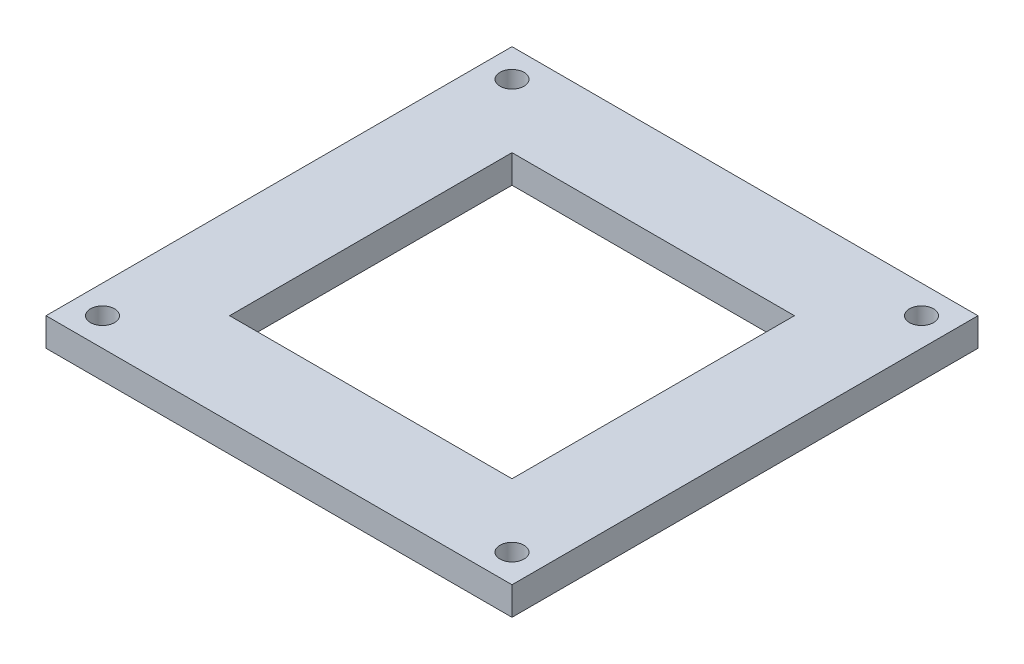
ISO-10303-21;
HEADER;
FILE_DESCRIPTION(('STEP AP214'),'2;1');
FILE_NAME('part.step','',(''),(''),'','','');
FILE_SCHEMA(('AUTOMOTIVE_DESIGN { 1 0 10303 214 1 1 1 1 }'));
ENDSEC;
DATA;
#1=APPLICATION_CONTEXT('core data for automotive mechanical design processes');
#2=APPLICATION_PROTOCOL_DEFINITION('international standard','automotive_design',2000,#1);
#3=PRODUCT_CONTEXT('',#1,'mechanical');
#4=PRODUCT('Part','Part','',(#3));
#5=PRODUCT_RELATED_PRODUCT_CATEGORY('part','',(#4));
#6=PRODUCT_DEFINITION_FORMATION('','',#4);
#7=PRODUCT_DEFINITION_CONTEXT('part definition',#1,'design');
#8=PRODUCT_DEFINITION('design','',#6,#7);
#9=PRODUCT_DEFINITION_SHAPE('','',#8);
#10=(LENGTH_UNIT() NAMED_UNIT(*) SI_UNIT(.MILLI.,.METRE.));
#11=(NAMED_UNIT(*) PLANE_ANGLE_UNIT() SI_UNIT($,.RADIAN.));
#12=(NAMED_UNIT(*) SI_UNIT($,.STERADIAN.) SOLID_ANGLE_UNIT());
#13=UNCERTAINTY_MEASURE_WITH_UNIT(LENGTH_MEASURE(1.E-05),#10,'distance_accuracy_value','');
#14=(GEOMETRIC_REPRESENTATION_CONTEXT(3) GLOBAL_UNCERTAINTY_ASSIGNED_CONTEXT((#13)) GLOBAL_UNIT_ASSIGNED_CONTEXT((#10,
#11,#12)) REPRESENTATION_CONTEXT('',''));
#15=CARTESIAN_POINT('',(0.,0.,0.));
#16=DIRECTION('',(0.,0.,1.));
#17=DIRECTION('',(1.,0.,0.));
#18=AXIS2_PLACEMENT_3D('',#15,#16,#17);
#19=CARTESIAN_POINT('',(0.,4.,0.));
#20=DIRECTION('',(0.,-1.,0.));
#21=DIRECTION('',(0.,0.,-1.));
#22=AXIS2_PLACEMENT_3D('',#19,#20,#21);
#23=PLANE('',#22);
#24=DIRECTION('',(0.,0.,-1.));
#25=VECTOR('',#24,1.);
#26=CARTESIAN_POINT('',(32.9999999999999,4.,33.));
#27=LINE('',#26,#25);
#28=CARTESIAN_POINT('',(32.9999999999999,4.,33.));
#29=VERTEX_POINT('',#28);
#30=CARTESIAN_POINT('',(32.9999999999999,4.,-33.));
#31=VERTEX_POINT('',#30);
#32=EDGE_CURVE('E156',#29,#31,#27,.T.);
#33=ORIENTED_EDGE('',*,*,#32,.T.);
#34=DIRECTION('',(-1.,0.,0.));
#35=VECTOR('',#34,1.);
#36=CARTESIAN_POINT('',(-32.9999999999999,4.,-33.));
#37=LINE('',#36,#35);
#38=CARTESIAN_POINT('',(-32.9999999999999,4.,-33.));
#39=VERTEX_POINT('',#38);
#40=EDGE_CURVE('E160',#31,#39,#37,.T.);
#41=ORIENTED_EDGE('',*,*,#40,.T.);
#42=DIRECTION('',(0.,0.,1.));
#43=VECTOR('',#42,1.);
#44=CARTESIAN_POINT('',(-32.9999999999999,4.,33.));
#45=LINE('',#44,#43);
#46=CARTESIAN_POINT('',(-32.9999999999999,4.,33.));
#47=VERTEX_POINT('',#46);
#48=EDGE_CURVE('E164',#39,#47,#45,.T.);
#49=ORIENTED_EDGE('',*,*,#48,.T.);
#50=DIRECTION('',(1.,0.,0.));
#51=VECTOR('',#50,1.);
#52=CARTESIAN_POINT('',(-32.9999999999999,4.,33.));
#53=LINE('',#52,#51);
#54=EDGE_CURVE('E167',#47,#29,#53,.T.);
#55=ORIENTED_EDGE('',*,*,#54,.T.);
#56=EDGE_LOOP('',(#33,#41,#49,#55));
#57=FACE_BOUND('',#56,.T.);
#58=DIRECTION('',(0.,0.,-1.));
#59=VECTOR('',#58,1.);
#60=CARTESIAN_POINT('',(19.9999999999999,4.,20.));
#61=LINE('',#60,#59);
#62=CARTESIAN_POINT('',(19.9999999999999,4.,20.));
#63=VERTEX_POINT('',#62);
#64=CARTESIAN_POINT('',(19.9999999999999,4.,-20.));
#65=VERTEX_POINT('',#64);
#66=EDGE_CURVE('E105',#63,#65,#61,.T.);
#67=ORIENTED_EDGE('',*,*,#66,.F.);
#68=DIRECTION('',(1.,0.,0.));
#69=VECTOR('',#68,1.);
#70=CARTESIAN_POINT('',(-19.9999999999999,4.,20.));
#71=LINE('',#70,#69);
#72=CARTESIAN_POINT('',(-19.9999999999999,4.,20.));
#73=VERTEX_POINT('',#72);
#74=EDGE_CURVE('E132',#73,#63,#71,.T.);
#75=ORIENTED_EDGE('',*,*,#74,.F.);
#76=DIRECTION('',(0.,0.,1.));
#77=VECTOR('',#76,1.);
#78=CARTESIAN_POINT('',(-19.9999999999999,4.,20.));
#79=LINE('',#78,#77);
#80=CARTESIAN_POINT('',(-19.9999999999999,4.,-20.));
#81=VERTEX_POINT('',#80);
#82=EDGE_CURVE('E128',#81,#73,#79,.T.);
#83=ORIENTED_EDGE('',*,*,#82,.F.);
#84=DIRECTION('',(-1.,0.,0.));
#85=VECTOR('',#84,1.);
#86=CARTESIAN_POINT('',(-19.9999999999999,4.,-20.));
#87=LINE('',#86,#85);
#88=EDGE_CURVE('E114',#65,#81,#87,.T.);
#89=ORIENTED_EDGE('',*,*,#88,.F.);
#90=EDGE_LOOP('',(#67,#75,#83,#89));
#91=FACE_BOUND('',#90,.T.);
#92=CARTESIAN_POINT('',(-29.,4.,-29.));
#93=DIRECTION('',(0.,1.,0.));
#94=DIRECTION('',(0.,0.,1.));
#95=AXIS2_PLACEMENT_3D('',#92,#93,#94);
#96=CIRCLE('',#95,1.70500000000002);
#97=CARTESIAN_POINT('',(-29.,4.,-27.295));
#98=VERTEX_POINT('',#97);
#99=EDGE_CURVE('E140',#98,#98,#96,.T.);
#100=ORIENTED_EDGE('',*,*,#99,.F.);
#101=EDGE_LOOP('',(#100));
#102=FACE_BOUND('',#101,.T.);
#103=CARTESIAN_POINT('',(28.9999999999999,4.,-29.));
#104=DIRECTION('',(0.,1.,0.));
#105=DIRECTION('',(0.,0.,1.));
#106=AXIS2_PLACEMENT_3D('',#103,#104,#105);
#107=CIRCLE('',#106,1.705);
#108=CARTESIAN_POINT('',(28.9999999999999,4.,-27.295));
#109=VERTEX_POINT('',#108);
#110=EDGE_CURVE('E283',#109,#109,#107,.T.);
#111=ORIENTED_EDGE('',*,*,#110,.F.);
#112=EDGE_LOOP('',(#111));
#113=FACE_BOUND('',#112,.T.);
#114=CARTESIAN_POINT('',(28.9999999999999,4.,29.));
#115=DIRECTION('',(0.,1.,0.));
#116=DIRECTION('',(0.,0.,1.));
#117=AXIS2_PLACEMENT_3D('',#114,#115,#116);
#118=CIRCLE('',#117,1.705);
#119=CARTESIAN_POINT('',(28.9999999999999,4.,30.705));
#120=VERTEX_POINT('',#119);
#121=EDGE_CURVE('E275',#120,#120,#118,.T.);
#122=ORIENTED_EDGE('',*,*,#121,.F.);
#123=EDGE_LOOP('',(#122));
#124=FACE_BOUND('',#123,.T.);
#125=CARTESIAN_POINT('',(-28.9999999999999,4.,29.));
#126=DIRECTION('',(0.,1.,0.));
#127=DIRECTION('',(0.,0.,1.));
#128=AXIS2_PLACEMENT_3D('',#125,#126,#127);
#129=CIRCLE('',#128,1.705);
#130=CARTESIAN_POINT('',(-28.9999999999999,4.,30.705));
#131=VERTEX_POINT('',#130);
#132=EDGE_CURVE('E264',#131,#131,#129,.T.);
#133=ORIENTED_EDGE('',*,*,#132,.F.);
#134=EDGE_LOOP('',(#133));
#135=FACE_BOUND('',#134,.T.);
#136=ADVANCED_FACE('F39',(#57,#91,#102,#113,#124,#135),#23,.F.);
#137=CARTESIAN_POINT('',(0.,0.,0.));
#138=DIRECTION('',(0.,-1.,0.));
#139=DIRECTION('',(0.,0.,-1.));
#140=AXIS2_PLACEMENT_3D('',#137,#138,#139);
#141=PLANE('',#140);
#142=CARTESIAN_POINT('',(28.9999999999999,0.,29.));
#143=DIRECTION('',(0.,1.,0.));
#144=DIRECTION('',(0.,0.,1.));
#145=AXIS2_PLACEMENT_3D('',#142,#143,#144);
#146=CIRCLE('',#145,1.705);
#147=CARTESIAN_POINT('',(28.9999999999999,0.,30.705));
#148=VERTEX_POINT('',#147);
#149=EDGE_CURVE('E272',#148,#148,#146,.T.);
#150=ORIENTED_EDGE('',*,*,#149,.T.);
#151=EDGE_LOOP('',(#150));
#152=FACE_BOUND('',#151,.T.);
#153=CARTESIAN_POINT('',(-29.,0.,-29.));
#154=DIRECTION('',(0.,1.,0.));
#155=DIRECTION('',(0.,0.,1.));
#156=AXIS2_PLACEMENT_3D('',#153,#154,#155);
#157=CIRCLE('',#156,1.70500000000002);
#158=CARTESIAN_POINT('',(-29.,0.,-27.295));
#159=VERTEX_POINT('',#158);
#160=EDGE_CURVE('E287',#159,#159,#157,.T.);
#161=ORIENTED_EDGE('',*,*,#160,.T.);
#162=EDGE_LOOP('',(#161));
#163=FACE_BOUND('',#162,.T.);
#164=DIRECTION('',(0.,0.,-1.));
#165=VECTOR('',#164,1.);
#166=CARTESIAN_POINT('',(32.9999999999999,0.,33.));
#167=LINE('',#166,#165);
#168=CARTESIAN_POINT('',(32.9999999999999,0.,33.));
#169=VERTEX_POINT('',#168);
#170=CARTESIAN_POINT('',(32.9999999999999,0.,-33.));
#171=VERTEX_POINT('',#170);
#172=EDGE_CURVE('E123',#169,#171,#167,.T.);
#173=ORIENTED_EDGE('',*,*,#172,.F.);
#174=DIRECTION('',(1.,0.,0.));
#175=VECTOR('',#174,1.);
#176=CARTESIAN_POINT('',(-32.9999999999999,0.,33.));
#177=LINE('',#176,#175);
#178=CARTESIAN_POINT('',(-32.9999999999999,0.,33.));
#179=VERTEX_POINT('',#178);
#180=EDGE_CURVE('E161',#179,#169,#177,.T.);
#181=ORIENTED_EDGE('',*,*,#180,.F.);
#182=DIRECTION('',(0.,0.,1.));
#183=VECTOR('',#182,1.);
#184=CARTESIAN_POINT('',(-32.9999999999999,0.,33.));
#185=LINE('',#184,#183);
#186=CARTESIAN_POINT('',(-32.9999999999999,0.,-33.));
#187=VERTEX_POINT('',#186);
#188=EDGE_CURVE('E177',#187,#179,#185,.T.);
#189=ORIENTED_EDGE('',*,*,#188,.F.);
#190=DIRECTION('',(-1.,0.,0.));
#191=VECTOR('',#190,1.);
#192=CARTESIAN_POINT('',(-32.9999999999999,0.,-33.));
#193=LINE('',#192,#191);
#194=EDGE_CURVE('E174',#171,#187,#193,.T.);
#195=ORIENTED_EDGE('',*,*,#194,.F.);
#196=EDGE_LOOP('',(#173,#181,#189,#195));
#197=FACE_BOUND('',#196,.T.);
#198=DIRECTION('',(1.,0.,0.));
#199=VECTOR('',#198,1.);
#200=CARTESIAN_POINT('',(-19.9999999999999,0.,20.));
#201=LINE('',#200,#199);
#202=CARTESIAN_POINT('',(-19.9999999999999,0.,20.));
#203=VERTEX_POINT('',#202);
#204=CARTESIAN_POINT('',(19.9999999999999,0.,20.));
#205=VERTEX_POINT('',#204);
#206=EDGE_CURVE('E115',#203,#205,#201,.T.);
#207=ORIENTED_EDGE('',*,*,#206,.T.);
#208=DIRECTION('',(0.,0.,-1.));
#209=VECTOR('',#208,1.);
#210=CARTESIAN_POINT('',(19.9999999999999,0.,20.));
#211=LINE('',#210,#209);
#212=CARTESIAN_POINT('',(19.9999999999999,0.,-20.));
#213=VERTEX_POINT('',#212);
#214=EDGE_CURVE('E63',#205,#213,#211,.T.);
#215=ORIENTED_EDGE('',*,*,#214,.T.);
#216=DIRECTION('',(-1.,0.,0.));
#217=VECTOR('',#216,1.);
#218=CARTESIAN_POINT('',(-19.9999999999999,0.,-20.));
#219=LINE('',#218,#217);
#220=CARTESIAN_POINT('',(-19.9999999999999,0.,-20.));
#221=VERTEX_POINT('',#220);
#222=EDGE_CURVE('E121',#213,#221,#219,.T.);
#223=ORIENTED_EDGE('',*,*,#222,.T.);
#224=DIRECTION('',(0.,0.,1.));
#225=VECTOR('',#224,1.);
#226=CARTESIAN_POINT('',(-19.9999999999999,0.,20.));
#227=LINE('',#226,#225);
#228=EDGE_CURVE('E143',#221,#203,#227,.T.);
#229=ORIENTED_EDGE('',*,*,#228,.T.);
#230=EDGE_LOOP('',(#207,#215,#223,#229));
#231=FACE_BOUND('',#230,.T.);
#232=CARTESIAN_POINT('',(28.9999999999999,0.,-29.));
#233=DIRECTION('',(0.,1.,0.));
#234=DIRECTION('',(0.,0.,1.));
#235=AXIS2_PLACEMENT_3D('',#232,#233,#234);
#236=CIRCLE('',#235,1.705);
#237=CARTESIAN_POINT('',(28.9999999999999,0.,-27.295));
#238=VERTEX_POINT('',#237);
#239=EDGE_CURVE('E279',#238,#238,#236,.T.);
#240=ORIENTED_EDGE('',*,*,#239,.T.);
#241=EDGE_LOOP('',(#240));
#242=FACE_BOUND('',#241,.T.);
#243=CARTESIAN_POINT('',(-28.9999999999999,0.,29.));
#244=DIRECTION('',(0.,1.,0.));
#245=DIRECTION('',(0.,0.,1.));
#246=AXIS2_PLACEMENT_3D('',#243,#244,#245);
#247=CIRCLE('',#246,1.705);
#248=CARTESIAN_POINT('',(-28.9999999999999,0.,30.705));
#249=VERTEX_POINT('',#248);
#250=EDGE_CURVE('E267',#249,#249,#247,.T.);
#251=ORIENTED_EDGE('',*,*,#250,.T.);
#252=EDGE_LOOP('',(#251));
#253=FACE_BOUND('',#252,.T.);
#254=ADVANCED_FACE('F200',(#152,#163,#197,#231,#242,#253),#141,.T.);
#255=CARTESIAN_POINT('',(32.9999999999999,4.,33.));
#256=DIRECTION('',(-1.,0.,0.));
#257=DIRECTION('',(0.,0.,1.));
#258=AXIS2_PLACEMENT_3D('',#255,#256,#257);
#259=PLANE('',#258);
#260=ORIENTED_EDGE('',*,*,#172,.T.);
#261=DIRECTION('',(0.,-1.,0.));
#262=VECTOR('',#261,1.);
#263=CARTESIAN_POINT('',(32.9999999999999,4.,-33.));
#264=LINE('',#263,#262);
#265=EDGE_CURVE('E11',#31,#171,#264,.T.);
#266=ORIENTED_EDGE('',*,*,#265,.F.);
#267=ORIENTED_EDGE('',*,*,#32,.F.);
#268=DIRECTION('',(0.,-1.,0.));
#269=VECTOR('',#268,1.);
#270=CARTESIAN_POINT('',(32.9999999999999,4.,33.));
#271=LINE('',#270,#269);
#272=EDGE_CURVE('E170',#29,#169,#271,.T.);
#273=ORIENTED_EDGE('',*,*,#272,.T.);
#274=EDGE_LOOP('',(#260,#266,#267,#273));
#275=FACE_BOUND('',#274,.T.);
#276=ADVANCED_FACE('F41',(#275),#259,.F.);
#277=CARTESIAN_POINT('',(-32.9999999999999,4.,-33.));
#278=DIRECTION('',(0.,0.,1.));
#279=DIRECTION('',(1.,0.,0.));
#280=AXIS2_PLACEMENT_3D('',#277,#278,#279);
#281=PLANE('',#280);
#282=ORIENTED_EDGE('',*,*,#194,.T.);
#283=DIRECTION('',(0.,-1.,0.));
#284=VECTOR('',#283,1.);
#285=CARTESIAN_POINT('',(-32.9999999999999,4.,-33.));
#286=LINE('',#285,#284);
#287=EDGE_CURVE('E48',#39,#187,#286,.T.);
#288=ORIENTED_EDGE('',*,*,#287,.F.);
#289=ORIENTED_EDGE('',*,*,#40,.F.);
#290=ORIENTED_EDGE('',*,*,#265,.T.);
#291=EDGE_LOOP('',(#282,#288,#289,#290));
#292=FACE_BOUND('',#291,.T.);
#293=ADVANCED_FACE('F210',(#292),#281,.F.);
#294=CARTESIAN_POINT('',(-32.9999999999999,4.,33.));
#295=DIRECTION('',(1.,0.,0.));
#296=DIRECTION('',(0.,0.,-1.));
#297=AXIS2_PLACEMENT_3D('',#294,#295,#296);
#298=PLANE('',#297);
#299=ORIENTED_EDGE('',*,*,#188,.T.);
#300=DIRECTION('',(0.,-1.,0.));
#301=VECTOR('',#300,1.);
#302=CARTESIAN_POINT('',(-32.9999999999999,4.,33.));
#303=LINE('',#302,#301);
#304=EDGE_CURVE('E185',#47,#179,#303,.T.);
#305=ORIENTED_EDGE('',*,*,#304,.F.);
#306=ORIENTED_EDGE('',*,*,#48,.F.);
#307=ORIENTED_EDGE('',*,*,#287,.T.);
#308=EDGE_LOOP('',(#299,#305,#306,#307));
#309=FACE_BOUND('',#308,.T.);
#310=ADVANCED_FACE('F194',(#309),#298,.F.);
#311=CARTESIAN_POINT('',(-32.9999999999999,4.,33.));
#312=DIRECTION('',(0.,0.,-1.));
#313=DIRECTION('',(-1.,0.,0.));
#314=AXIS2_PLACEMENT_3D('',#311,#312,#313);
#315=PLANE('',#314);
#316=ORIENTED_EDGE('',*,*,#180,.T.);
#317=ORIENTED_EDGE('',*,*,#272,.F.);
#318=ORIENTED_EDGE('',*,*,#54,.F.);
#319=ORIENTED_EDGE('',*,*,#304,.T.);
#320=EDGE_LOOP('',(#316,#317,#318,#319));
#321=FACE_BOUND('',#320,.T.);
#322=ADVANCED_FACE('F204',(#321),#315,.F.);
#323=CARTESIAN_POINT('',(19.9999999999999,4.,20.));
#324=DIRECTION('',(-1.,0.,0.));
#325=DIRECTION('',(0.,0.,1.));
#326=AXIS2_PLACEMENT_3D('',#323,#324,#325);
#327=PLANE('',#326);
#328=ORIENTED_EDGE('',*,*,#214,.F.);
#329=DIRECTION('',(0.,-1.,0.));
#330=VECTOR('',#329,1.);
#331=CARTESIAN_POINT('',(19.9999999999999,4.,20.));
#332=LINE('',#331,#330);
#333=EDGE_CURVE('E109',#63,#205,#332,.T.);
#334=ORIENTED_EDGE('',*,*,#333,.F.);
#335=ORIENTED_EDGE('',*,*,#66,.T.);
#336=DIRECTION('',(0.,-1.,0.));
#337=VECTOR('',#336,1.);
#338=CARTESIAN_POINT('',(19.9999999999999,4.,-20.));
#339=LINE('',#338,#337);
#340=EDGE_CURVE('E108',#65,#213,#339,.T.);
#341=ORIENTED_EDGE('',*,*,#340,.T.);
#342=EDGE_LOOP('',(#328,#334,#335,#341));
#343=FACE_BOUND('',#342,.T.);
#344=ADVANCED_FACE('F107',(#343),#327,.T.);
#345=CARTESIAN_POINT('',(-19.9999999999999,4.,-20.));
#346=DIRECTION('',(0.,0.,1.));
#347=DIRECTION('',(1.,0.,0.));
#348=AXIS2_PLACEMENT_3D('',#345,#346,#347);
#349=PLANE('',#348);
#350=ORIENTED_EDGE('',*,*,#222,.F.);
#351=ORIENTED_EDGE('',*,*,#340,.F.);
#352=ORIENTED_EDGE('',*,*,#88,.T.);
#353=DIRECTION('',(0.,-1.,0.));
#354=VECTOR('',#353,1.);
#355=CARTESIAN_POINT('',(-19.9999999999999,4.,-20.));
#356=LINE('',#355,#354);
#357=EDGE_CURVE('E124',#81,#221,#356,.T.);
#358=ORIENTED_EDGE('',*,*,#357,.T.);
#359=EDGE_LOOP('',(#350,#351,#352,#358));
#360=FACE_BOUND('',#359,.T.);
#361=ADVANCED_FACE('F118',(#360),#349,.T.);
#362=CARTESIAN_POINT('',(-19.9999999999999,4.,20.));
#363=DIRECTION('',(1.,0.,0.));
#364=DIRECTION('',(0.,0.,-1.));
#365=AXIS2_PLACEMENT_3D('',#362,#363,#364);
#366=PLANE('',#365);
#367=ORIENTED_EDGE('',*,*,#228,.F.);
#368=ORIENTED_EDGE('',*,*,#357,.F.);
#369=ORIENTED_EDGE('',*,*,#82,.T.);
#370=DIRECTION('',(0.,-1.,0.));
#371=VECTOR('',#370,1.);
#372=CARTESIAN_POINT('',(-19.9999999999999,4.,20.));
#373=LINE('',#372,#371);
#374=EDGE_CURVE('E55',#73,#203,#373,.T.);
#375=ORIENTED_EDGE('',*,*,#374,.T.);
#376=EDGE_LOOP('',(#367,#368,#369,#375));
#377=FACE_BOUND('',#376,.T.);
#378=ADVANCED_FACE('F234',(#377),#366,.T.);
#379=CARTESIAN_POINT('',(-19.9999999999999,4.,20.));
#380=DIRECTION('',(0.,0.,-1.));
#381=DIRECTION('',(-1.,0.,0.));
#382=AXIS2_PLACEMENT_3D('',#379,#380,#381);
#383=PLANE('',#382);
#384=ORIENTED_EDGE('',*,*,#206,.F.);
#385=ORIENTED_EDGE('',*,*,#374,.F.);
#386=ORIENTED_EDGE('',*,*,#74,.T.);
#387=ORIENTED_EDGE('',*,*,#333,.T.);
#388=EDGE_LOOP('',(#384,#385,#386,#387));
#389=FACE_BOUND('',#388,.T.);
#390=ADVANCED_FACE('F238',(#389),#383,.T.);
#391=CARTESIAN_POINT('',(-29.,4.,-29.));
#392=DIRECTION('',(0.,-1.,0.));
#393=DIRECTION('',(0.,0.,-1.));
#394=AXIS2_PLACEMENT_3D('',#391,#392,#393);
#395=CYLINDRICAL_SURFACE('',#394,1.70500000000002);
#396=ORIENTED_EDGE('',*,*,#99,.T.);
#397=EDGE_LOOP('',(#396));
#398=FACE_BOUND('',#397,.T.);
#399=ORIENTED_EDGE('',*,*,#160,.F.);
#400=EDGE_LOOP('',(#399));
#401=FACE_BOUND('',#400,.T.);
#402=ADVANCED_FACE('F244',(#398,#401),#395,.F.);
#403=CARTESIAN_POINT('',(28.9999999999999,4.,-29.));
#404=DIRECTION('',(0.,-1.,0.));
#405=DIRECTION('',(0.,0.,-1.));
#406=AXIS2_PLACEMENT_3D('',#403,#404,#405);
#407=CYLINDRICAL_SURFACE('',#406,1.705);
#408=ORIENTED_EDGE('',*,*,#110,.T.);
#409=EDGE_LOOP('',(#408));
#410=FACE_BOUND('',#409,.T.);
#411=ORIENTED_EDGE('',*,*,#239,.F.);
#412=EDGE_LOOP('',(#411));
#413=FACE_BOUND('',#412,.T.);
#414=ADVANCED_FACE('F247',(#410,#413),#407,.F.);
#415=CARTESIAN_POINT('',(28.9999999999999,4.,29.));
#416=DIRECTION('',(0.,-1.,0.));
#417=DIRECTION('',(0.,0.,-1.));
#418=AXIS2_PLACEMENT_3D('',#415,#416,#417);
#419=CYLINDRICAL_SURFACE('',#418,1.705);
#420=ORIENTED_EDGE('',*,*,#121,.T.);
#421=EDGE_LOOP('',(#420));
#422=FACE_BOUND('',#421,.T.);
#423=ORIENTED_EDGE('',*,*,#149,.F.);
#424=EDGE_LOOP('',(#423));
#425=FACE_BOUND('',#424,.T.);
#426=ADVANCED_FACE('F251',(#422,#425),#419,.F.);
#427=CARTESIAN_POINT('',(-28.9999999999999,4.,29.));
#428=DIRECTION('',(0.,-1.,0.));
#429=DIRECTION('',(0.,0.,-1.));
#430=AXIS2_PLACEMENT_3D('',#427,#428,#429);
#431=CYLINDRICAL_SURFACE('',#430,1.705);
#432=ORIENTED_EDGE('',*,*,#132,.T.);
#433=EDGE_LOOP('',(#432));
#434=FACE_BOUND('',#433,.T.);
#435=ORIENTED_EDGE('',*,*,#250,.F.);
#436=EDGE_LOOP('',(#435));
#437=FACE_BOUND('',#436,.T.);
#438=ADVANCED_FACE('F255',(#434,#437),#431,.F.);
#439=CLOSED_SHELL('',(#136,#254,#276,#293,#310,#322,#344,#361,#378,#390,#402,#414,#426,#438));
#440=MANIFOLD_SOLID_BREP('B2',#439);
#441=ADVANCED_BREP_SHAPE_REPRESENTATION('',(#18,#440),#14);
#442=SHAPE_DEFINITION_REPRESENTATION(#9,#441);
ENDSEC;
END-ISO-10303-21;
